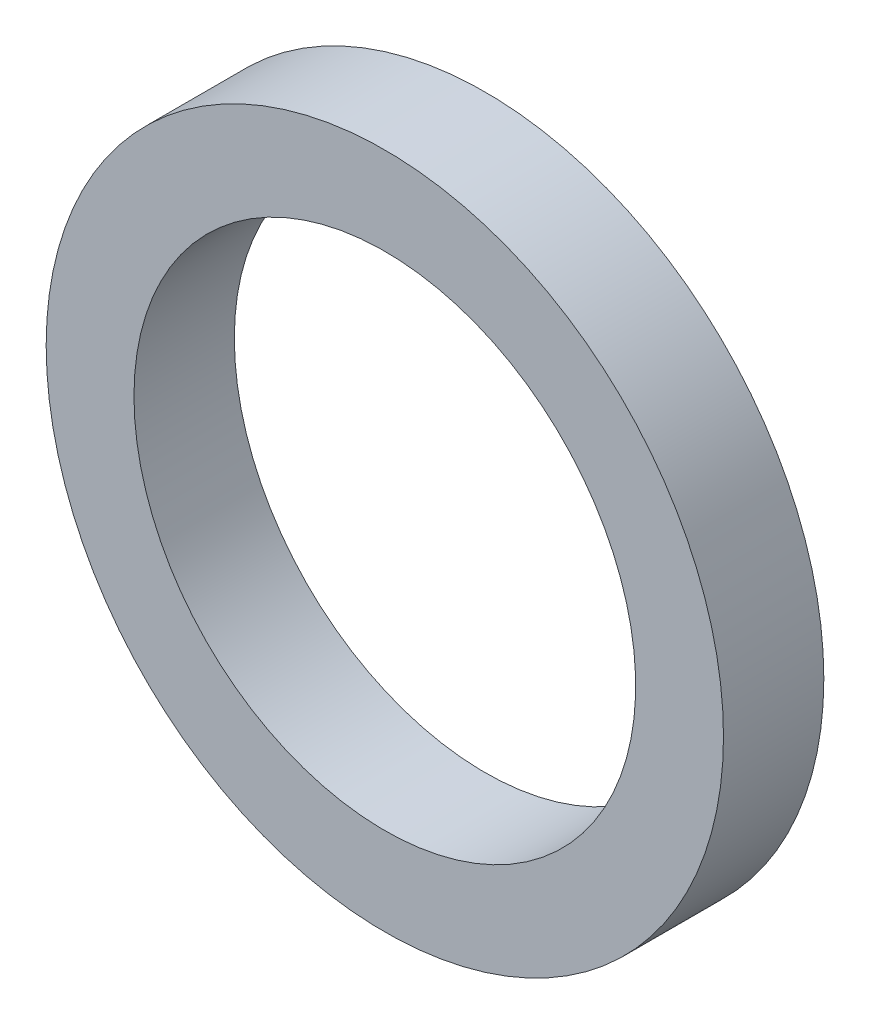
ISO-10303-21;
HEADER;
FILE_DESCRIPTION(('STEP AP214'),'2;1');
FILE_NAME('part.step','',(''),(''),'','','');
FILE_SCHEMA(('AUTOMOTIVE_DESIGN { 1 0 10303 214 1 1 1 1 }'));
ENDSEC;
DATA;
#1=APPLICATION_CONTEXT('core data for automotive mechanical design processes');
#2=APPLICATION_PROTOCOL_DEFINITION('international standard','automotive_design',2000,#1);
#3=PRODUCT_CONTEXT('',#1,'mechanical');
#4=PRODUCT('Part','Part','',(#3));
#5=PRODUCT_RELATED_PRODUCT_CATEGORY('part','',(#4));
#6=PRODUCT_DEFINITION_FORMATION('','',#4);
#7=PRODUCT_DEFINITION_CONTEXT('part definition',#1,'design');
#8=PRODUCT_DEFINITION('design','',#6,#7);
#9=PRODUCT_DEFINITION_SHAPE('','',#8);
#10=(LENGTH_UNIT() NAMED_UNIT(*) SI_UNIT(.MILLI.,.METRE.));
#11=(NAMED_UNIT(*) PLANE_ANGLE_UNIT() SI_UNIT($,.RADIAN.));
#12=(NAMED_UNIT(*) SI_UNIT($,.STERADIAN.) SOLID_ANGLE_UNIT());
#13=UNCERTAINTY_MEASURE_WITH_UNIT(LENGTH_MEASURE(1.E-05),#10,'distance_accuracy_value','');
#14=(GEOMETRIC_REPRESENTATION_CONTEXT(3) GLOBAL_UNCERTAINTY_ASSIGNED_CONTEXT((#13)) GLOBAL_UNIT_ASSIGNED_CONTEXT((#10,
#11,#12)) REPRESENTATION_CONTEXT('',''));
#15=CARTESIAN_POINT('',(0.,0.,0.));
#16=DIRECTION('',(0.,0.,1.));
#17=DIRECTION('',(1.,0.,0.));
#18=AXIS2_PLACEMENT_3D('',#15,#16,#17);
#19=CARTESIAN_POINT('',(0.,0.,4.));
#20=DIRECTION('',(0.,0.,-1.));
#21=DIRECTION('',(-1.,0.,0.));
#22=AXIS2_PLACEMENT_3D('',#19,#20,#21);
#23=CYLINDRICAL_SURFACE('',#22,13.5);
#24=CARTESIAN_POINT('',(0.,0.,4.));
#25=DIRECTION('',(0.,0.,1.));
#26=DIRECTION('',(1.,0.,0.));
#27=AXIS2_PLACEMENT_3D('',#24,#25,#26);
#28=CIRCLE('',#27,13.5);
#29=CARTESIAN_POINT('',(13.5,0.,4.));
#30=VERTEX_POINT('',#29);
#31=EDGE_CURVE('E10',#30,#30,#28,.T.);
#32=ORIENTED_EDGE('',*,*,#31,.F.);
#33=EDGE_LOOP('',(#32));
#34=FACE_BOUND('',#33,.T.);
#35=CARTESIAN_POINT('',(0.,0.,0.));
#36=DIRECTION('',(0.,0.,1.));
#37=DIRECTION('',(1.,0.,0.));
#38=AXIS2_PLACEMENT_3D('',#35,#36,#37);
#39=CIRCLE('',#38,13.5);
#40=CARTESIAN_POINT('',(13.5,0.,0.));
#41=VERTEX_POINT('',#40);
#42=EDGE_CURVE('E40',#41,#41,#39,.T.);
#43=ORIENTED_EDGE('',*,*,#42,.T.);
#44=EDGE_LOOP('',(#43));
#45=FACE_BOUND('',#44,.T.);
#46=ADVANCED_FACE('F37',(#34,#45),#23,.T.);
#47=CARTESIAN_POINT('',(0.,0.,4.));
#48=DIRECTION('',(0.,0.,1.));
#49=DIRECTION('',(1.,0.,0.));
#50=AXIS2_PLACEMENT_3D('',#47,#48,#49);
#51=PLANE('',#50);
#52=CARTESIAN_POINT('',(0.,0.,4.));
#53=DIRECTION('',(0.,0.,-1.));
#54=DIRECTION('',(-1.,0.,0.));
#55=AXIS2_PLACEMENT_3D('',#52,#53,#54);
#56=CIRCLE('',#55,10.);
#57=CARTESIAN_POINT('',(-10.,0.,4.));
#58=VERTEX_POINT('',#57);
#59=EDGE_CURVE('E49',#58,#58,#56,.T.);
#60=ORIENTED_EDGE('',*,*,#59,.T.);
#61=EDGE_LOOP('',(#60));
#62=FACE_BOUND('',#61,.T.);
#63=ORIENTED_EDGE('',*,*,#31,.T.);
#64=EDGE_LOOP('',(#63));
#65=FACE_BOUND('',#64,.T.);
#66=ADVANCED_FACE('F59',(#62,#65),#51,.T.);
#67=CARTESIAN_POINT('',(0.,0.,0.));
#68=DIRECTION('',(0.,0.,1.));
#69=DIRECTION('',(1.,0.,0.));
#70=AXIS2_PLACEMENT_3D('',#67,#68,#69);
#71=PLANE('',#70);
#72=CARTESIAN_POINT('',(0.,0.,0.));
#73=DIRECTION('',(0.,0.,-1.));
#74=DIRECTION('',(-1.,0.,0.));
#75=AXIS2_PLACEMENT_3D('',#72,#73,#74);
#76=CIRCLE('',#75,10.);
#77=CARTESIAN_POINT('',(-10.,0.,0.));
#78=VERTEX_POINT('',#77);
#79=EDGE_CURVE('E51',#78,#78,#76,.T.);
#80=ORIENTED_EDGE('',*,*,#79,.F.);
#81=EDGE_LOOP('',(#80));
#82=FACE_BOUND('',#81,.T.);
#83=ORIENTED_EDGE('',*,*,#42,.F.);
#84=EDGE_LOOP('',(#83));
#85=FACE_BOUND('',#84,.T.);
#86=ADVANCED_FACE('F64',(#82,#85),#71,.F.);
#87=CARTESIAN_POINT('',(0.,0.,4.));
#88=DIRECTION('',(0.,0.,-1.));
#89=DIRECTION('',(-1.,0.,0.));
#90=AXIS2_PLACEMENT_3D('',#87,#88,#89);
#91=CYLINDRICAL_SURFACE('',#90,10.);
#92=ORIENTED_EDGE('',*,*,#59,.F.);
#93=EDGE_LOOP('',(#92));
#94=FACE_BOUND('',#93,.T.);
#95=ORIENTED_EDGE('',*,*,#79,.T.);
#96=EDGE_LOOP('',(#95));
#97=FACE_BOUND('',#96,.T.);
#98=ADVANCED_FACE('F61',(#94,#97),#91,.F.);
#99=CLOSED_SHELL('',(#46,#66,#86,#98));
#100=MANIFOLD_SOLID_BREP('B2',#99);
#101=ADVANCED_BREP_SHAPE_REPRESENTATION('',(#18,#100),#14);
#102=SHAPE_DEFINITION_REPRESENTATION(#9,#101);
ENDSEC;
END-ISO-10303-21;
